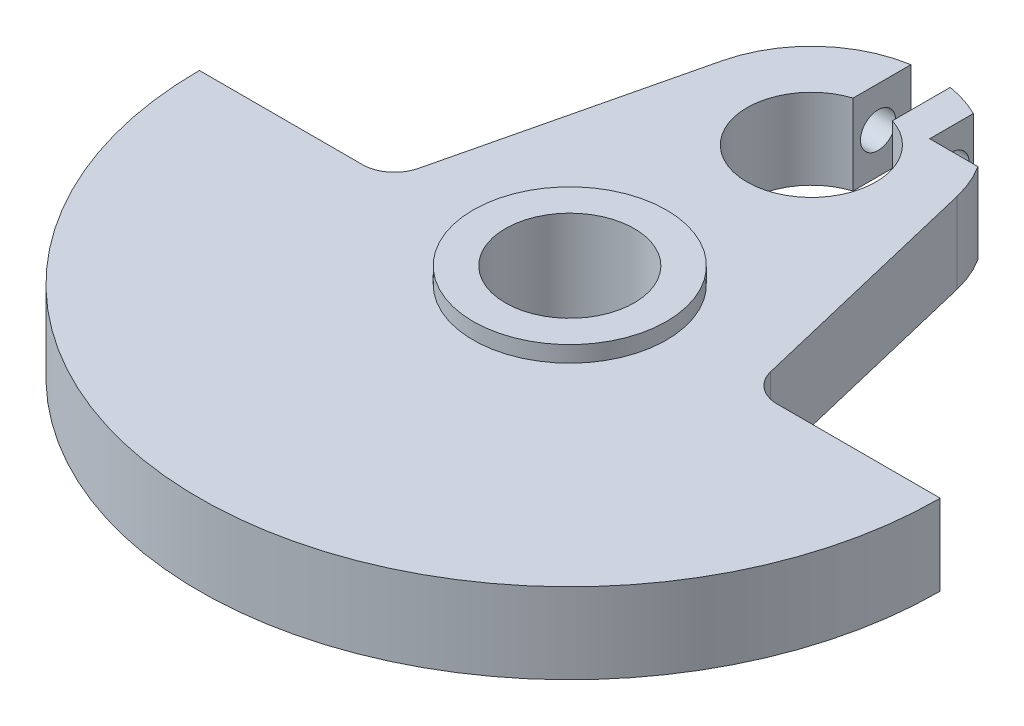
ISO-10303-21;
HEADER;
FILE_DESCRIPTION(('STEP AP214'),'2;1');
FILE_NAME('part.step','',(''),(''),'','','');
FILE_SCHEMA(('AUTOMOTIVE_DESIGN { 1 0 10303 214 1 1 1 1 }'));
ENDSEC;
DATA;
#1=APPLICATION_CONTEXT('core data for automotive mechanical design processes');
#2=APPLICATION_PROTOCOL_DEFINITION('international standard','automotive_design',2000,#1);
#3=PRODUCT_CONTEXT('',#1,'mechanical');
#4=PRODUCT('Part','Part','',(#3));
#5=PRODUCT_RELATED_PRODUCT_CATEGORY('part','',(#4));
#6=PRODUCT_DEFINITION_FORMATION('','',#4);
#7=PRODUCT_DEFINITION_CONTEXT('part definition',#1,'design');
#8=PRODUCT_DEFINITION('design','',#6,#7);
#9=PRODUCT_DEFINITION_SHAPE('','',#8);
#10=(LENGTH_UNIT() NAMED_UNIT(*) SI_UNIT(.MILLI.,.METRE.));
#11=(NAMED_UNIT(*) PLANE_ANGLE_UNIT() SI_UNIT($,.RADIAN.));
#12=(NAMED_UNIT(*) SI_UNIT($,.STERADIAN.) SOLID_ANGLE_UNIT());
#13=UNCERTAINTY_MEASURE_WITH_UNIT(LENGTH_MEASURE(1.E-05),#10,'distance_accuracy_value','');
#14=(GEOMETRIC_REPRESENTATION_CONTEXT(3) GLOBAL_UNCERTAINTY_ASSIGNED_CONTEXT((#13)) GLOBAL_UNIT_ASSIGNED_CONTEXT((#10,
#11,#12)) REPRESENTATION_CONTEXT('',''));
#15=CARTESIAN_POINT('',(0.,0.,0.));
#16=DIRECTION('',(0.,0.,1.));
#17=DIRECTION('',(1.,0.,0.));
#18=AXIS2_PLACEMENT_3D('',#15,#16,#17);
#19=CARTESIAN_POINT('',(0.,5.,-15.));
#20=DIRECTION('',(0.,-1.,0.));
#21=DIRECTION('',(0.,0.,-1.));
#22=AXIS2_PLACEMENT_3D('',#19,#20,#21);
#23=CYLINDRICAL_SURFACE('',#22,7.5);
#24=CARTESIAN_POINT('',(0.,5.,-15.));
#25=DIRECTION('',(0.,1.,0.));
#26=DIRECTION('',(0.,0.,1.));
#27=AXIS2_PLACEMENT_3D('',#24,#25,#26);
#28=CIRCLE('',#27,7.5);
#29=CARTESIAN_POINT('',(3.34428877022475,5.,-21.7131015649511));
#30=VERTEX_POINT('',#29);
#31=CARTESIAN_POINT('',(1.22065556157335,5.,-22.4));
#32=VERTEX_POINT('',#31);
#33=EDGE_CURVE('E229',#30,#32,#28,.T.);
#34=ORIENTED_EDGE('',*,*,#33,.F.);
#35=DIRECTION('',(0.,1.,0.));
#36=VECTOR('',#35,1.);
#37=CARTESIAN_POINT('',(3.34428877022475,-5.,-21.7131015649511));
#38=LINE('',#37,#36);
#39=CARTESIAN_POINT('',(3.34428877022475,0.,-21.7131015649511));
#40=VERTEX_POINT('',#39);
#41=EDGE_CURVE('E162',#40,#30,#38,.T.);
#42=ORIENTED_EDGE('',*,*,#41,.F.);
#43=CARTESIAN_POINT('',(0.,0.,-15.));
#44=DIRECTION('',(0.,1.,0.));
#45=DIRECTION('',(0.,0.,1.));
#46=AXIS2_PLACEMENT_3D('',#43,#44,#45);
#47=CIRCLE('',#46,7.5);
#48=CARTESIAN_POINT('',(1.22065556157336,0.,-22.4));
#49=VERTEX_POINT('',#48);
#50=EDGE_CURVE('E67',#40,#49,#47,.T.);
#51=ORIENTED_EDGE('',*,*,#50,.T.);
#52=DIRECTION('',(0.,1.,0.));
#53=VECTOR('',#52,1.);
#54=CARTESIAN_POINT('',(1.22065556157335,-5.,-22.4));
#55=LINE('',#54,#53);
#56=EDGE_CURVE('E200',#49,#32,#55,.T.);
#57=ORIENTED_EDGE('',*,*,#56,.T.);
#58=EDGE_LOOP('',(#34,#42,#51,#57));
#59=FACE_BOUND('',#58,.T.);
#60=ADVANCED_FACE('F42',(#59),#23,.T.);
#61=CARTESIAN_POINT('',(-3.82669697274159,2.5,-21.4503015649511));
#62=CARTESIAN_POINT('',(-3.82669928130983,2.53393569622543,-21.4503003406648));
#63=CARTESIAN_POINT('',(-3.82939375114992,2.56788092493394,-21.4487039639403));
#64=CARTESIAN_POINT('',(-3.83984613179999,2.63469958030938,-21.4424852601792));
#65=CARTESIAN_POINT('',(-3.84761017627981,2.6675716579203,-21.4378592675951));
#66=CARTESIAN_POINT('',(-3.86996863230368,2.73974274700897,-21.4244494213989));
#67=CARTESIAN_POINT('',(-3.88580984738943,2.77850666761312,-21.4148999021591));
#68=CARTESIAN_POINT('',(-3.92246173587816,2.85258003425906,-21.3925547586091));
#69=CARTESIAN_POINT('',(-3.9432830546488,2.88788184868147,-21.3797521769138));
#70=CARTESIAN_POINT('',(-4.00203971602199,2.97541285657541,-21.3431440738191));
#71=CARTESIAN_POINT('',(-4.04270677846446,3.02495812549658,-21.3173684729042));
#72=CARTESIAN_POINT('',(-4.12905792636834,3.11649744295039,-21.2612746074731));
#73=CARTESIAN_POINT('',(-4.17475542865725,3.1584704691529,-21.2309441120672));
#74=CARTESIAN_POINT('',(-4.26197323181263,3.23009332904819,-21.1715427701418));
#75=CARTESIAN_POINT('',(-4.3030955651004,3.26064734533713,-21.1429624127618));
#76=CARTESIAN_POINT('',(-4.38666949271357,3.31749162294398,-21.0835654367029));
#77=CARTESIAN_POINT('',(-4.42912194268096,3.34377906955707,-21.0527473610199));
#78=CARTESIAN_POINT('',(-4.55768768612363,3.41670954759116,-20.9572509173701));
#79=CARTESIAN_POINT('',(-4.64498779692712,3.45740386403652,-20.8895448639376));
#80=CARTESIAN_POINT('',(-4.82400137468685,3.52506599013681,-20.7439532139093));
#81=CARTESIAN_POINT('',(-4.91572489217409,3.55127828322477,-20.6657343940692));
#82=CARTESIAN_POINT('',(-5.09705763837074,3.58569964461631,-20.5031592911539));
#83=CARTESIAN_POINT('',(-5.18666944863723,3.59393195805962,-20.4188110784038));
#84=CARTESIAN_POINT('',(-5.34346399550269,3.59028108098706,-20.2637404686692));
#85=CARTESIAN_POINT('',(-5.41147701305196,3.58217764269216,-20.1937720644461));
#86=CARTESIAN_POINT('',(-5.54316902871275,3.55117887642657,-20.0529703561569));
#87=CARTESIAN_POINT('',(-5.60685330919122,3.52830194823468,-19.9821382353319));
#88=CARTESIAN_POINT('',(-5.71413607577338,3.47296456535768,-19.8583711995083));
#89=CARTESIAN_POINT('',(-5.75900476306389,3.44387569614168,-19.8050359219047));
#90=CARTESIAN_POINT('',(-5.84385858099201,3.3749767654413,-19.701465131374));
#91=CARTESIAN_POINT('',(-5.88384995146326,3.3351806160159,-19.6512256993658));
#92=CARTESIAN_POINT('',(-5.9508476941981,3.25290482585525,-19.5650667282073));
#93=CARTESIAN_POINT('',(-5.97889043516184,3.21225536743807,-19.5282106248161));
#94=CARTESIAN_POINT('',(-6.03003182484578,3.12387076668761,-19.4598807272806));
#95=CARTESIAN_POINT('',(-6.05313179078869,3.07613751790303,-19.4284054996128));
#96=CARTESIAN_POINT('',(-6.09371162707224,2.9740335513412,-19.3724010061019));
#97=CARTESIAN_POINT('',(-6.11115001285246,2.91961769589371,-19.3479231620693));
#98=CARTESIAN_POINT('',(-6.13942156462048,2.80597892810599,-19.3079127889247));
#99=CARTESIAN_POINT('',(-6.15025959890045,2.74675959534174,-19.2923736672534));
#100=CARTESIAN_POINT('',(-6.16390769582609,2.63337849012873,-19.2727467027248));
#101=CARTESIAN_POINT('',(-6.16755883416576,2.57952264835695,-19.2674603989998));
#102=CARTESIAN_POINT('',(-6.1693025396818,2.47154288388304,-19.264939700656));
#103=CARTESIAN_POINT('',(-6.16739751258686,2.41741908733196,-19.2677018212008));
#104=CARTESIAN_POINT('',(-6.15839484653984,2.31394067302709,-19.2806806881231));
#105=CARTESIAN_POINT('',(-6.15162329237717,2.26449729873343,-19.2904291974531));
#106=CARTESIAN_POINT('',(-6.13348233412216,2.1682115653982,-19.3163227888497));
#107=CARTESIAN_POINT('',(-6.12211283597888,2.12136925958376,-19.3324680017607));
#108=CARTESIAN_POINT('',(-6.09467809332261,2.02985178382106,-19.3709807251768));
#109=CARTESIAN_POINT('',(-6.0784704956084,1.98529884086825,-19.3935356952197));
#110=CARTESIAN_POINT('',(-6.04199266409521,1.90088675518016,-19.4435663635227));
#111=CARTESIAN_POINT('',(-6.0217211464299,1.86102910210591,-19.4710436165292));
#112=CARTESIAN_POINT('',(-5.97514759747478,1.78228780894268,-19.5331307440468));
#113=CARTESIAN_POINT('',(-5.94842441600791,1.74401335616336,-19.5681948096897));
#114=CARTESIAN_POINT('',(-5.89127016738782,1.67404104085055,-19.6416712144979));
#115=CARTESIAN_POINT('',(-5.86083671919804,1.64234743716511,-19.6800856992226));
#116=CARTESIAN_POINT('',(-5.78182497527731,1.57203972250905,-19.7776611570419));
#117=CARTESIAN_POINT('',(-5.7314446273439,1.53718125131164,-19.8380824080666));
#118=CARTESIAN_POINT('',(-5.62570588097358,1.48043416493786,-19.9606487608614));
#119=CARTESIAN_POINT('',(-5.5703372636102,1.45857290495714,-20.0227972123115));
#120=CARTESIAN_POINT('',(-5.43739196489079,1.4213174575963,-20.1669341400712));
#121=CARTESIAN_POINT('',(-5.35845029572946,1.41034064400308,-20.2487997484408));
#122=CARTESIAN_POINT('',(-5.19670087548146,1.40604013119286,-20.4090041474206));
#123=CARTESIAN_POINT('',(-5.1138891607517,1.41273493824398,-20.4873391533205));
#124=CARTESIAN_POINT('',(-4.9444920217378,1.44200149525516,-20.6405076426835));
#125=CARTESIAN_POINT('',(-4.85786364186707,1.46492122983493,-20.7152253156982));
#126=CARTESIAN_POINT('',(-4.68452038466542,1.52588308738487,-20.8581452867041));
#127=CARTESIAN_POINT('',(-4.59780550996733,1.56392476327411,-20.9263477772429));
#128=CARTESIAN_POINT('',(-4.44506452793701,1.64567831364095,-21.0414007609767));
#129=CARTESIAN_POINT('',(-4.37856002446408,1.68646441562985,-21.0897077225617));
#130=CARTESIAN_POINT('',(-4.24910675821605,1.77861113126298,-21.180718762939));
#131=CARTESIAN_POINT('',(-4.18615105673574,1.82995012819074,-21.2234340076461));
#132=CARTESIAN_POINT('',(-4.09262488682045,1.92099932654604,-21.2850721601604));
#133=CARTESIAN_POINT('',(-4.05957990730887,1.95650382196685,-21.3064399577743));
#134=CARTESIAN_POINT('',(-3.9973572313955,2.03237966169916,-21.3460603473724));
#135=CARTESIAN_POINT('',(-3.96817524480093,2.07274551022838,-21.3643164018155));
#136=CARTESIAN_POINT('',(-3.9224483276851,2.147923857984,-21.3925686368974));
#137=CARTESIAN_POINT('',(-3.90457261896801,2.18156822835992,-21.4034867060206));
#138=CARTESIAN_POINT('',(-3.87350358339642,2.25173862855914,-21.4223283008049));
#139=CARTESIAN_POINT('',(-3.86030047268836,2.28825843904795,-21.4302580858562));
#140=CARTESIAN_POINT('',(-3.84254453965518,2.35403700605249,-21.4408796629473));
#141=CARTESIAN_POINT('',(-3.83664903322573,2.38279930412899,-21.4443886410419));
#142=CARTESIAN_POINT('',(-3.82872515328936,2.44103889741245,-21.4490995831627));
#143=CARTESIAN_POINT('',(-3.82669496700198,2.47051585088385,-21.4503026286404));
#144=CARTESIAN_POINT('',(-3.82669697274159,2.5,-21.4503015649511));
#145=B_SPLINE_CURVE_WITH_KNOTS('',3,(#61,#62,#63,#64,#65,#66,#67,#68,#69,#70,#71,#72,#73,#74,
#75,#76,#77,#78,#79,#80,#81,#82,#83,#84,#85,#86,#87,#88,#89,#90,#91,#92,#93,#94,#95,#96,#97,#98,
#99,#100,#101,#102,#103,#104,#105,#106,#107,#108,#109,#110,#111,#112,#113,#114,#115,#116,#117,
#118,#119,#120,#121,#122,#123,#124,#125,#126,#127,#128,#129,#130,#131,#132,#133,#134,#135,#136,
#137,#138,#139,#140,#141,#142,#143,#144),.UNSPECIFIED.,.T.,.F.,(4,2,2,2,2,2,2,2,2,2,2,2,2,2,2,2,
2,2,2,2,2,2,2,2,2,2,2,2,2,2,2,2,2,2,2,2,2,2,2,2,2,4),(0.,0.101688136885721,0.203499534621864,
0.331627898168534,0.460032633280378,0.666140365414502,0.872811779340773,1.0485616785013,
1.2244270547043,1.5762497589701,1.94501748455072,2.31330817154704,2.60605445301145,
2.8984368322753,3.12419537127576,3.34966198513946,3.53378501273669,3.71785891126578,
3.9032526484467,4.08850947663779,4.25036739252094,4.41215523698142,4.56400702566806,
4.71586192063984,4.87271936668054,5.02962644515741,5.20410907257022,5.37870426824828,
5.6354138485841,5.89266182955949,6.23359599256361,6.57488733399008,6.92372940617591,
7.27256116559606,7.54721769399809,7.82131712018617,7.98000287470097,8.13851088915099,
8.25703012320742,8.37529970326775,8.46369026658413,8.55203936575584),.UNSPECIFIED.);
#146=CARTESIAN_POINT('',(-3.82669697274159,2.5,-21.4503015649511));
#147=VERTEX_POINT('',#146);
#148=EDGE_CURVE('E166',#147,#147,#145,.T.);
#149=ORIENTED_EDGE('',*,*,#148,.T.);
#150=EDGE_LOOP('',(#149));
#151=FACE_BOUND('',#150,.T.);
#152=CARTESIAN_POINT('',(-1.22065556157336,5.,-22.4));
#153=VERTEX_POINT('',#152);
#154=CARTESIAN_POINT('',(-7.29418530553555,5.,-16.7449529301701));
#155=VERTEX_POINT('',#154);
#156=EDGE_CURVE('E225',#153,#155,#28,.T.);
#157=ORIENTED_EDGE('',*,*,#156,.F.);
#158=DIRECTION('',(0.,1.,0.));
#159=VECTOR('',#158,1.);
#160=CARTESIAN_POINT('',(-1.22065556157336,-5.,-22.4));
#161=LINE('',#160,#159);
#162=CARTESIAN_POINT('',(-1.22065556157336,0.,-22.4));
#163=VERTEX_POINT('',#162);
#164=EDGE_CURVE('E197',#163,#153,#161,.T.);
#165=ORIENTED_EDGE('',*,*,#164,.F.);
#166=CARTESIAN_POINT('',(-7.29418530553555,0.,-16.7449529301701));
#167=VERTEX_POINT('',#166);
#168=EDGE_CURVE('E251',#163,#167,#47,.T.);
#169=ORIENTED_EDGE('',*,*,#168,.T.);
#170=DIRECTION('',(0.,-1.,0.));
#171=VECTOR('',#170,1.);
#172=CARTESIAN_POINT('',(-7.29418530553555,5.,-16.7449529301701));
#173=LINE('',#172,#171);
#174=EDGE_CURVE('E289',#155,#167,#173,.T.);
#175=ORIENTED_EDGE('',*,*,#174,.F.);
#176=EDGE_LOOP('',(#157,#165,#169,#175));
#177=FACE_BOUND('',#176,.T.);
#178=ADVANCED_FACE('F324',(#151,#177),#23,.T.);
#179=CARTESIAN_POINT('',(12.8779821402295,5.,-2.));
#180=DIRECTION('',(0.,-1.,0.));
#181=DIRECTION('',(0.,0.,-1.));
#182=AXIS2_PLACEMENT_3D('',#179,#180,#181);
#183=CYLINDRICAL_SURFACE('',#182,2.);
#184=CARTESIAN_POINT('',(12.8779821402295,0.,-2.));
#185=DIRECTION('',(0.,-1.,0.));
#186=DIRECTION('',(0.,0.,-1.));
#187=AXIS2_PLACEMENT_3D('',#184,#185,#186);
#188=CIRCLE('',#187,2.);
#189=CARTESIAN_POINT('',(12.8779821402295,0.,0.));
#190=VERTEX_POINT('',#189);
#191=CARTESIAN_POINT('',(10.9328660587534,0.,-1.53467921862131));
#192=VERTEX_POINT('',#191);
#193=EDGE_CURVE('E216',#190,#192,#188,.T.);
#194=ORIENTED_EDGE('',*,*,#193,.T.);
#195=DIRECTION('',(0.,-1.,0.));
#196=VECTOR('',#195,1.);
#197=CARTESIAN_POINT('',(10.9328660587534,5.,-1.53467921862131));
#198=LINE('',#197,#196);
#199=CARTESIAN_POINT('',(10.9328660587534,5.,-1.53467921862131));
#200=VERTEX_POINT('',#199);
#201=EDGE_CURVE('E297',#200,#192,#198,.T.);
#202=ORIENTED_EDGE('',*,*,#201,.F.);
#203=CARTESIAN_POINT('',(12.8779821402295,5.,-2.));
#204=DIRECTION('',(0.,-1.,0.));
#205=DIRECTION('',(0.,0.,-1.));
#206=AXIS2_PLACEMENT_3D('',#203,#204,#205);
#207=CIRCLE('',#206,2.);
#208=CARTESIAN_POINT('',(12.8779821402295,5.,0.));
#209=VERTEX_POINT('',#208);
#210=EDGE_CURVE('E217',#209,#200,#207,.T.);
#211=ORIENTED_EDGE('',*,*,#210,.F.);
#212=DIRECTION('',(0.,-1.,0.));
#213=VECTOR('',#212,1.);
#214=CARTESIAN_POINT('',(12.8779821402295,5.,0.));
#215=LINE('',#214,#213);
#216=EDGE_CURVE('E244',#209,#190,#215,.T.);
#217=ORIENTED_EDGE('',*,*,#216,.T.);
#218=EDGE_LOOP('',(#194,#202,#211,#217));
#219=FACE_BOUND('',#218,.T.);
#220=ADVANCED_FACE('F44',(#219),#183,.F.);
#221=CARTESIAN_POINT('',(10.9328660587534,5.,-1.53467921862131));
#222=DIRECTION('',(-0.972558040738073,0.,0.232660390689349));
#223=DIRECTION('',(0.232660390689349,0.,0.972558040738073));
#224=AXIS2_PLACEMENT_3D('',#221,#222,#223);
#225=PLANE('',#224);
#226=DIRECTION('',(-0.232660390689349,0.,-0.972558040738073));
#227=VECTOR('',#226,1.);
#228=CARTESIAN_POINT('',(10.9328660587534,0.,-1.53467921862131));
#229=LINE('',#228,#227);
#230=CARTESIAN_POINT('',(7.29418530553555,0.,-16.7449529301701));
#231=VERTEX_POINT('',#230);
#232=EDGE_CURVE('E248',#192,#231,#229,.T.);
#233=ORIENTED_EDGE('',*,*,#232,.T.);
#234=DIRECTION('',(0.,-1.,0.));
#235=VECTOR('',#234,1.);
#236=CARTESIAN_POINT('',(7.29418530553555,5.,-16.7449529301701));
#237=LINE('',#236,#235);
#238=CARTESIAN_POINT('',(7.29418530553555,5.,-16.7449529301701));
#239=VERTEX_POINT('',#238);
#240=EDGE_CURVE('E293',#239,#231,#237,.T.);
#241=ORIENTED_EDGE('',*,*,#240,.F.);
#242=DIRECTION('',(-0.232660390689349,0.,-0.972558040738073));
#243=VECTOR('',#242,1.);
#244=CARTESIAN_POINT('',(10.9328660587534,5.,-1.53467921862131));
#245=LINE('',#244,#243);
#246=EDGE_CURVE('E221',#200,#239,#245,.T.);
#247=ORIENTED_EDGE('',*,*,#246,.F.);
#248=ORIENTED_EDGE('',*,*,#201,.T.);
#249=EDGE_LOOP('',(#233,#241,#247,#248));
#250=FACE_BOUND('',#249,.T.);
#251=ADVANCED_FACE('F365',(#250),#225,.F.);
#252=CARTESIAN_POINT('',(6.34428877022476,0.,-19.));
#253=VERTEX_POINT('',#252);
#254=EDGE_CURVE('E252',#231,#253,#47,.T.);
#255=ORIENTED_EDGE('',*,*,#254,.T.);
#256=DIRECTION('',(0.,1.,0.));
#257=VECTOR('',#256,1.);
#258=CARTESIAN_POINT('',(6.34428877022476,-5.,-19.));
#259=LINE('',#258,#257);
#260=CARTESIAN_POINT('',(6.34428877022476,5.,-19.));
#261=VERTEX_POINT('',#260);
#262=EDGE_CURVE('E59',#253,#261,#259,.T.);
#263=ORIENTED_EDGE('',*,*,#262,.T.);
#264=EDGE_CURVE('E171',#239,#261,#28,.T.);
#265=ORIENTED_EDGE('',*,*,#264,.F.);
#266=ORIENTED_EDGE('',*,*,#240,.T.);
#267=EDGE_LOOP('',(#255,#263,#265,#266));
#268=FACE_BOUND('',#267,.T.);
#269=ADVANCED_FACE('F362',(#268),#23,.T.);
#270=CARTESIAN_POINT('',(-10.9328660587534,5.,-1.53467921862131));
#271=DIRECTION('',(0.972558040738073,0.,0.232660390689349));
#272=DIRECTION('',(0.232660390689349,0.,-0.972558040738073));
#273=AXIS2_PLACEMENT_3D('',#270,#271,#272);
#274=PLANE('',#273);
#275=DIRECTION('',(-0.232660390689349,0.,0.972558040738073));
#276=VECTOR('',#275,1.);
#277=CARTESIAN_POINT('',(-10.9328660587534,0.,-1.53467921862131));
#278=LINE('',#277,#276);
#279=CARTESIAN_POINT('',(-10.9328660587534,0.,-1.53467921862131));
#280=VERTEX_POINT('',#279);
#281=EDGE_CURVE('E256',#167,#280,#278,.T.);
#282=ORIENTED_EDGE('',*,*,#281,.T.);
#283=DIRECTION('',(0.,-1.,0.));
#284=VECTOR('',#283,1.);
#285=CARTESIAN_POINT('',(-10.9328660587534,5.,-1.53467921862131));
#286=LINE('',#285,#284);
#287=CARTESIAN_POINT('',(-10.9328660587534,5.,-1.53467921862131));
#288=VERTEX_POINT('',#287);
#289=EDGE_CURVE('E285',#288,#280,#286,.T.);
#290=ORIENTED_EDGE('',*,*,#289,.F.);
#291=DIRECTION('',(-0.232660390689349,0.,0.972558040738073));
#292=VECTOR('',#291,1.);
#293=CARTESIAN_POINT('',(-10.9328660587534,5.,-1.53467921862131));
#294=LINE('',#293,#292);
#295=EDGE_CURVE('E228',#155,#288,#294,.T.);
#296=ORIENTED_EDGE('',*,*,#295,.F.);
#297=ORIENTED_EDGE('',*,*,#174,.T.);
#298=EDGE_LOOP('',(#282,#290,#296,#297));
#299=FACE_BOUND('',#298,.T.);
#300=ADVANCED_FACE('F330',(#299),#274,.F.);
#301=CARTESIAN_POINT('',(-12.8779821402295,5.,-2.));
#302=DIRECTION('',(0.,-1.,0.));
#303=DIRECTION('',(0.,0.,-1.));
#304=AXIS2_PLACEMENT_3D('',#301,#302,#303);
#305=CYLINDRICAL_SURFACE('',#304,2.);
#306=CARTESIAN_POINT('',(-12.8779821402295,0.,-2.));
#307=DIRECTION('',(0.,-1.,0.));
#308=DIRECTION('',(0.,0.,1.));
#309=AXIS2_PLACEMENT_3D('',#306,#307,#308);
#310=CIRCLE('',#309,2.);
#311=CARTESIAN_POINT('',(-12.8779821402295,0.,0.));
#312=VERTEX_POINT('',#311);
#313=EDGE_CURVE('E259',#280,#312,#310,.T.);
#314=ORIENTED_EDGE('',*,*,#313,.T.);
#315=DIRECTION('',(0.,-1.,0.));
#316=VECTOR('',#315,1.);
#317=CARTESIAN_POINT('',(-12.8779821402295,5.,0.));
#318=LINE('',#317,#316);
#319=CARTESIAN_POINT('',(-12.8779821402295,5.,0.));
#320=VERTEX_POINT('',#319);
#321=EDGE_CURVE('E281',#320,#312,#318,.T.);
#322=ORIENTED_EDGE('',*,*,#321,.F.);
#323=CARTESIAN_POINT('',(-12.8779821402295,5.,-2.));
#324=DIRECTION('',(0.,-1.,0.));
#325=DIRECTION('',(0.,0.,1.));
#326=AXIS2_PLACEMENT_3D('',#323,#324,#325);
#327=CIRCLE('',#326,2.);
#328=EDGE_CURVE('E232',#288,#320,#327,.T.);
#329=ORIENTED_EDGE('',*,*,#328,.F.);
#330=ORIENTED_EDGE('',*,*,#289,.T.);
#331=EDGE_LOOP('',(#314,#322,#329,#330));
#332=FACE_BOUND('',#331,.T.);
#333=ADVANCED_FACE('F339',(#332),#305,.F.);
#334=CARTESIAN_POINT('',(-23.,5.,0.));
#335=DIRECTION('',(0.,0.,1.));
#336=DIRECTION('',(1.,0.,0.));
#337=AXIS2_PLACEMENT_3D('',#334,#335,#336);
#338=PLANE('',#337);
#339=DIRECTION('',(-1.,0.,0.));
#340=VECTOR('',#339,1.);
#341=CARTESIAN_POINT('',(-23.,0.,0.));
#342=LINE('',#341,#340);
#343=CARTESIAN_POINT('',(-23.,0.,0.));
#344=VERTEX_POINT('',#343);
#345=EDGE_CURVE('E262',#312,#344,#342,.T.);
#346=ORIENTED_EDGE('',*,*,#345,.T.);
#347=DIRECTION('',(0.,-1.,0.));
#348=VECTOR('',#347,1.);
#349=CARTESIAN_POINT('',(-23.,5.,0.));
#350=LINE('',#349,#348);
#351=CARTESIAN_POINT('',(-23.,5.,0.));
#352=VERTEX_POINT('',#351);
#353=EDGE_CURVE('E277',#352,#344,#350,.T.);
#354=ORIENTED_EDGE('',*,*,#353,.F.);
#355=DIRECTION('',(-1.,0.,0.));
#356=VECTOR('',#355,1.);
#357=CARTESIAN_POINT('',(-23.,5.,0.));
#358=LINE('',#357,#356);
#359=EDGE_CURVE('E235',#320,#352,#358,.T.);
#360=ORIENTED_EDGE('',*,*,#359,.F.);
#361=ORIENTED_EDGE('',*,*,#321,.T.);
#362=EDGE_LOOP('',(#346,#354,#360,#361));
#363=FACE_BOUND('',#362,.T.);
#364=ADVANCED_FACE('F343',(#363),#338,.F.);
#365=CARTESIAN_POINT('',(0.,5.,0.));
#366=DIRECTION('',(0.,-1.,0.));
#367=DIRECTION('',(0.,0.,-1.));
#368=AXIS2_PLACEMENT_3D('',#365,#366,#367);
#369=CYLINDRICAL_SURFACE('',#368,23.);
#370=CARTESIAN_POINT('',(0.,0.,0.));
#371=DIRECTION('',(0.,1.,0.));
#372=DIRECTION('',(0.,0.,1.));
#373=AXIS2_PLACEMENT_3D('',#370,#371,#372);
#374=CIRCLE('',#373,23.);
#375=CARTESIAN_POINT('',(23.,0.,0.));
#376=VERTEX_POINT('',#375);
#377=EDGE_CURVE('E265',#344,#376,#374,.T.);
#378=ORIENTED_EDGE('',*,*,#377,.T.);
#379=DIRECTION('',(0.,-1.,0.));
#380=VECTOR('',#379,1.);
#381=CARTESIAN_POINT('',(23.,5.,0.));
#382=LINE('',#381,#380);
#383=CARTESIAN_POINT('',(23.,5.,0.));
#384=VERTEX_POINT('',#383);
#385=EDGE_CURVE('E273',#384,#376,#382,.T.);
#386=ORIENTED_EDGE('',*,*,#385,.F.);
#387=CARTESIAN_POINT('',(0.,5.,0.));
#388=DIRECTION('',(0.,1.,0.));
#389=DIRECTION('',(0.,0.,1.));
#390=AXIS2_PLACEMENT_3D('',#387,#388,#389);
#391=CIRCLE('',#390,23.);
#392=EDGE_CURVE('E238',#352,#384,#391,.T.);
#393=ORIENTED_EDGE('',*,*,#392,.F.);
#394=ORIENTED_EDGE('',*,*,#353,.T.);
#395=EDGE_LOOP('',(#378,#386,#393,#394));
#396=FACE_BOUND('',#395,.T.);
#397=ADVANCED_FACE('F376',(#396),#369,.T.);
#398=CARTESIAN_POINT('',(23.,5.,0.));
#399=DIRECTION('',(0.,0.,1.));
#400=DIRECTION('',(1.,0.,0.));
#401=AXIS2_PLACEMENT_3D('',#398,#399,#400);
#402=PLANE('',#401);
#403=DIRECTION('',(-1.,0.,0.));
#404=VECTOR('',#403,1.);
#405=CARTESIAN_POINT('',(23.,0.,0.));
#406=LINE('',#405,#404);
#407=EDGE_CURVE('E222',#376,#190,#406,.T.);
#408=ORIENTED_EDGE('',*,*,#407,.T.);
#409=ORIENTED_EDGE('',*,*,#216,.F.);
#410=DIRECTION('',(-1.,0.,0.));
#411=VECTOR('',#410,1.);
#412=CARTESIAN_POINT('',(23.,5.,0.));
#413=LINE('',#412,#411);
#414=EDGE_CURVE('E241',#384,#209,#413,.T.);
#415=ORIENTED_EDGE('',*,*,#414,.F.);
#416=ORIENTED_EDGE('',*,*,#385,.T.);
#417=EDGE_LOOP('',(#408,#409,#415,#416));
#418=FACE_BOUND('',#417,.T.);
#419=ADVANCED_FACE('F374',(#418),#402,.F.);
#420=CARTESIAN_POINT('',(12.8779821402295,5.,-2.));
#421=DIRECTION('',(0.,-1.,0.));
#422=DIRECTION('',(0.,0.,-1.));
#423=AXIS2_PLACEMENT_3D('',#420,#421,#422);
#424=PLANE('',#423);
#425=CARTESIAN_POINT('',(0.,5.,0.));
#426=DIRECTION('',(0.,-1.,0.));
#427=DIRECTION('',(0.,0.,-1.));
#428=AXIS2_PLACEMENT_3D('',#425,#426,#427);
#429=CIRCLE('',#428,6.);
#430=CARTESIAN_POINT('',(0.,5.,-6.));
#431=VERTEX_POINT('',#430);
#432=EDGE_CURVE('E301',#431,#431,#429,.F.);
#433=ORIENTED_EDGE('',*,*,#432,.F.);
#434=EDGE_LOOP('',(#433));
#435=FACE_BOUND('',#434,.T.);
#436=DIRECTION('',(1.,0.,0.));
#437=VECTOR('',#436,1.);
#438=CARTESIAN_POINT('',(3.34428877022476,5.,-19.));
#439=LINE('',#438,#437);
#440=CARTESIAN_POINT('',(3.34428877022476,5.,-19.));
#441=VERTEX_POINT('',#440);
#442=EDGE_CURVE('E154',#441,#261,#439,.T.);
#443=ORIENTED_EDGE('',*,*,#442,.F.);
#444=DIRECTION('',(0.,0.,1.));
#445=VECTOR('',#444,1.);
#446=CARTESIAN_POINT('',(3.34428877022476,5.,-19.));
#447=LINE('',#446,#445);
#448=EDGE_CURVE('E160',#30,#441,#447,.T.);
#449=ORIENTED_EDGE('',*,*,#448,.F.);
#450=ORIENTED_EDGE('',*,*,#33,.T.);
#451=DIRECTION('',(0.,0.,-1.));
#452=VECTOR('',#451,1.);
#453=CARTESIAN_POINT('',(1.22065556157336,5.,-18.8091993909482));
#454=LINE('',#453,#452);
#455=CARTESIAN_POINT('',(1.22065556157336,5.,-18.8091993909482));
#456=VERTEX_POINT('',#455);
#457=EDGE_CURVE('E184',#456,#32,#454,.T.);
#458=ORIENTED_EDGE('',*,*,#457,.F.);
#459=CARTESIAN_POINT('',(0.,5.,-15.));
#460=DIRECTION('',(0.,1.,0.));
#461=DIRECTION('',(0.,0.,1.));
#462=AXIS2_PLACEMENT_3D('',#459,#460,#461);
#463=CIRCLE('',#462,4.);
#464=CARTESIAN_POINT('',(-1.22065556157336,5.,-18.8091993909482));
#465=VERTEX_POINT('',#464);
#466=EDGE_CURVE('E178',#465,#456,#463,.T.);
#467=ORIENTED_EDGE('',*,*,#466,.F.);
#468=DIRECTION('',(0.,0.,1.));
#469=VECTOR('',#468,1.);
#470=CARTESIAN_POINT('',(-1.22065556157336,5.,-18.8091993909482));
#471=LINE('',#470,#469);
#472=EDGE_CURVE('E188',#153,#465,#471,.T.);
#473=ORIENTED_EDGE('',*,*,#472,.F.);
#474=ORIENTED_EDGE('',*,*,#156,.T.);
#475=ORIENTED_EDGE('',*,*,#295,.T.);
#476=ORIENTED_EDGE('',*,*,#328,.T.);
#477=ORIENTED_EDGE('',*,*,#359,.T.);
#478=ORIENTED_EDGE('',*,*,#392,.T.);
#479=ORIENTED_EDGE('',*,*,#414,.T.);
#480=ORIENTED_EDGE('',*,*,#210,.T.);
#481=ORIENTED_EDGE('',*,*,#246,.T.);
#482=ORIENTED_EDGE('',*,*,#264,.T.);
#483=EDGE_LOOP('',(#443,#449,#450,#458,#467,#473,#474,#475,#476,#477,#478,#479,#480,#481,#482));
#484=FACE_BOUND('',#483,.T.);
#485=ADVANCED_FACE('F169',(#435,#484),#424,.F.);
#486=CARTESIAN_POINT('',(12.8779821402295,0.,-2.));
#487=DIRECTION('',(0.,-1.,0.));
#488=DIRECTION('',(0.,0.,-1.));
#489=AXIS2_PLACEMENT_3D('',#486,#487,#488);
#490=PLANE('',#489);
#491=DIRECTION('',(0.,0.,-1.));
#492=VECTOR('',#491,1.);
#493=CARTESIAN_POINT('',(3.34428877022475,0.,-2.));
#494=LINE('',#493,#492);
#495=CARTESIAN_POINT('',(3.34428877022476,0.,-19.));
#496=VERTEX_POINT('',#495);
#497=EDGE_CURVE('E11',#496,#40,#494,.T.);
#498=ORIENTED_EDGE('',*,*,#497,.F.);
#499=DIRECTION('',(-1.,0.,0.));
#500=VECTOR('',#499,1.);
#501=CARTESIAN_POINT('',(12.8779821402295,0.,-19.));
#502=LINE('',#501,#500);
#503=EDGE_CURVE('E52',#253,#496,#502,.T.);
#504=ORIENTED_EDGE('',*,*,#503,.F.);
#505=ORIENTED_EDGE('',*,*,#254,.F.);
#506=ORIENTED_EDGE('',*,*,#232,.F.);
#507=ORIENTED_EDGE('',*,*,#193,.F.);
#508=ORIENTED_EDGE('',*,*,#407,.F.);
#509=ORIENTED_EDGE('',*,*,#377,.F.);
#510=ORIENTED_EDGE('',*,*,#345,.F.);
#511=ORIENTED_EDGE('',*,*,#313,.F.);
#512=ORIENTED_EDGE('',*,*,#281,.F.);
#513=ORIENTED_EDGE('',*,*,#168,.F.);
#514=DIRECTION('',(0.,0.,-1.));
#515=VECTOR('',#514,1.);
#516=CARTESIAN_POINT('',(-1.22065556157336,0.,-2.));
#517=LINE('',#516,#515);
#518=CARTESIAN_POINT('',(-1.22065556157336,0.,-18.8091993909482));
#519=VERTEX_POINT('',#518);
#520=EDGE_CURVE('E311',#519,#163,#517,.T.);
#521=ORIENTED_EDGE('',*,*,#520,.F.);
#522=CARTESIAN_POINT('',(0.,0.,-15.));
#523=DIRECTION('',(0.,-1.,0.));
#524=DIRECTION('',(0.,0.,-1.));
#525=AXIS2_PLACEMENT_3D('',#522,#523,#524);
#526=CIRCLE('',#525,4.);
#527=CARTESIAN_POINT('',(1.22065556157336,0.,-18.8091993909482));
#528=VERTEX_POINT('',#527);
#529=EDGE_CURVE('E308',#528,#519,#526,.T.);
#530=ORIENTED_EDGE('',*,*,#529,.F.);
#531=DIRECTION('',(0.,0.,1.));
#532=VECTOR('',#531,1.);
#533=CARTESIAN_POINT('',(1.22065556157336,0.,-2.));
#534=LINE('',#533,#532);
#535=EDGE_CURVE('E305',#49,#528,#534,.T.);
#536=ORIENTED_EDGE('',*,*,#535,.F.);
#537=ORIENTED_EDGE('',*,*,#50,.F.);
#538=EDGE_LOOP('',(#498,#504,#505,#506,#507,#508,#509,#510,#511,#512,#513,#521,#530,#536,#537));
#539=FACE_BOUND('',#538,.T.);
#540=CARTESIAN_POINT('',(0.,0.,0.));
#541=DIRECTION('',(0.,1.,0.));
#542=DIRECTION('',(0.,0.,1.));
#543=AXIS2_PLACEMENT_3D('',#540,#541,#542);
#544=CIRCLE('',#543,4.);
#545=CARTESIAN_POINT('',(0.,0.,4.));
#546=VERTEX_POINT('',#545);
#547=EDGE_CURVE('E205',#546,#546,#544,.T.);
#548=ORIENTED_EDGE('',*,*,#547,.T.);
#549=EDGE_LOOP('',(#548));
#550=FACE_BOUND('',#549,.T.);
#551=ADVANCED_FACE('F333',(#539,#550),#490,.T.);
#552=CARTESIAN_POINT('',(0.,6.,0.));
#553=DIRECTION('',(0.,-1.,0.));
#554=DIRECTION('',(0.,0.,-1.));
#555=AXIS2_PLACEMENT_3D('',#552,#553,#554);
#556=CYLINDRICAL_SURFACE('',#555,6.);
#557=CARTESIAN_POINT('',(0.,6.,0.));
#558=DIRECTION('',(0.,1.,0.));
#559=DIRECTION('',(0.,0.,1.));
#560=AXIS2_PLACEMENT_3D('',#557,#558,#559);
#561=CIRCLE('',#560,6.);
#562=CARTESIAN_POINT('',(0.,6.,6.));
#563=VERTEX_POINT('',#562);
#564=EDGE_CURVE('E209',#563,#563,#561,.T.);
#565=ORIENTED_EDGE('',*,*,#564,.F.);
#566=EDGE_LOOP('',(#565));
#567=FACE_BOUND('',#566,.T.);
#568=ORIENTED_EDGE('',*,*,#432,.T.);
#569=EDGE_LOOP('',(#568));
#570=FACE_BOUND('',#569,.T.);
#571=ADVANCED_FACE('F454',(#567,#570),#556,.T.);
#572=CARTESIAN_POINT('',(0.,6.,0.));
#573=DIRECTION('',(0.,1.,0.));
#574=DIRECTION('',(0.,0.,1.));
#575=AXIS2_PLACEMENT_3D('',#572,#573,#574);
#576=PLANE('',#575);
#577=CARTESIAN_POINT('',(0.,6.,0.));
#578=DIRECTION('',(0.,1.,0.));
#579=DIRECTION('',(0.,0.,1.));
#580=AXIS2_PLACEMENT_3D('',#577,#578,#579);
#581=CIRCLE('',#580,4.);
#582=CARTESIAN_POINT('',(0.,6.,4.));
#583=VERTEX_POINT('',#582);
#584=EDGE_CURVE('E196',#583,#583,#581,.T.);
#585=ORIENTED_EDGE('',*,*,#584,.F.);
#586=EDGE_LOOP('',(#585));
#587=FACE_BOUND('',#586,.T.);
#588=ORIENTED_EDGE('',*,*,#564,.T.);
#589=EDGE_LOOP('',(#588));
#590=FACE_BOUND('',#589,.T.);
#591=ADVANCED_FACE('F459',(#587,#590),#576,.T.);
#592=CARTESIAN_POINT('',(0.,0.,0.));
#593=DIRECTION('',(0.,1.,0.));
#594=DIRECTION('',(0.,0.,1.));
#595=AXIS2_PLACEMENT_3D('',#592,#593,#594);
#596=CYLINDRICAL_SURFACE('',#595,4.);
#597=ORIENTED_EDGE('',*,*,#547,.F.);
#598=EDGE_LOOP('',(#597));
#599=FACE_BOUND('',#598,.T.);
#600=ORIENTED_EDGE('',*,*,#584,.T.);
#601=EDGE_LOOP('',(#600));
#602=FACE_BOUND('',#601,.T.);
#603=ADVANCED_FACE('F472',(#599,#602),#596,.F.);
#604=CARTESIAN_POINT('',(0.,-5.,-15.));
#605=DIRECTION('',(0.,1.,0.));
#606=DIRECTION('',(0.,0.,1.));
#607=AXIS2_PLACEMENT_3D('',#604,#605,#606);
#608=CYLINDRICAL_SURFACE('',#607,4.);
#609=ORIENTED_EDGE('',*,*,#529,.T.);
#610=DIRECTION('',(0.,1.,0.));
#611=VECTOR('',#610,1.);
#612=CARTESIAN_POINT('',(-1.22065556157336,-5.,-18.8091993909482));
#613=LINE('',#612,#611);
#614=EDGE_CURVE('E193',#519,#465,#613,.T.);
#615=ORIENTED_EDGE('',*,*,#614,.T.);
#616=ORIENTED_EDGE('',*,*,#466,.T.);
#617=DIRECTION('',(0.,1.,0.));
#618=VECTOR('',#617,1.);
#619=CARTESIAN_POINT('',(1.22065556157336,-5.,-18.8091993909482));
#620=LINE('',#619,#618);
#621=EDGE_CURVE('E192',#528,#456,#620,.T.);
#622=ORIENTED_EDGE('',*,*,#621,.F.);
#623=EDGE_LOOP('',(#609,#615,#616,#622));
#624=FACE_BOUND('',#623,.T.);
#625=ADVANCED_FACE('F357',(#624),#608,.F.);
#626=CARTESIAN_POINT('',(-1.22065556157336,-5.,-18.8091993909482));
#627=DIRECTION('',(-1.,0.,0.));
#628=DIRECTION('',(0.,0.,1.));
#629=AXIS2_PLACEMENT_3D('',#626,#627,#628);
#630=PLANE('',#629);
#631=CARTESIAN_POINT('',(-1.22065556157335,2.5,-20.3581015649511));
#632=DIRECTION('',(-1.,0.,0.));
#633=DIRECTION('',(0.,0.,1.));
#634=AXIS2_PLACEMENT_3D('',#631,#632,#633);
#635=CIRCLE('',#634,1.0922);
#636=CARTESIAN_POINT('',(-1.22065556157335,2.5,-19.2659015649511));
#637=VERTEX_POINT('',#636);
#638=EDGE_CURVE('E615',#637,#637,#635,.T.);
#639=ORIENTED_EDGE('',*,*,#638,.T.);
#640=EDGE_LOOP('',(#639));
#641=FACE_BOUND('',#640,.T.);
#642=ORIENTED_EDGE('',*,*,#520,.T.);
#643=ORIENTED_EDGE('',*,*,#164,.T.);
#644=ORIENTED_EDGE('',*,*,#472,.T.);
#645=ORIENTED_EDGE('',*,*,#614,.F.);
#646=EDGE_LOOP('',(#642,#643,#644,#645));
#647=FACE_BOUND('',#646,.T.);
#648=ADVANCED_FACE('F352',(#641,#647),#630,.F.);
#649=CARTESIAN_POINT('',(1.22065556157336,-5.,-18.8091993909482));
#650=DIRECTION('',(1.,0.,0.));
#651=DIRECTION('',(0.,0.,-1.));
#652=AXIS2_PLACEMENT_3D('',#649,#650,#651);
#653=PLANE('',#652);
#654=CARTESIAN_POINT('',(1.22065556157335,2.5,-20.3581015649511));
#655=DIRECTION('',(1.,0.,0.));
#656=DIRECTION('',(0.,0.,-1.));
#657=AXIS2_PLACEMENT_3D('',#654,#655,#656);
#658=CIRCLE('',#657,1.0922);
#659=CARTESIAN_POINT('',(1.22065556157335,2.5,-21.4503015649511));
#660=VERTEX_POINT('',#659);
#661=EDGE_CURVE('E619',#660,#660,#658,.T.);
#662=ORIENTED_EDGE('',*,*,#661,.T.);
#663=EDGE_LOOP('',(#662));
#664=FACE_BOUND('',#663,.T.);
#665=ORIENTED_EDGE('',*,*,#535,.T.);
#666=ORIENTED_EDGE('',*,*,#621,.T.);
#667=ORIENTED_EDGE('',*,*,#457,.T.);
#668=ORIENTED_EDGE('',*,*,#56,.F.);
#669=EDGE_LOOP('',(#665,#666,#667,#668));
#670=FACE_BOUND('',#669,.T.);
#671=ADVANCED_FACE('F359',(#664,#670),#653,.F.);
#672=CARTESIAN_POINT('',(3.34428877022476,-5.,-19.));
#673=DIRECTION('',(-1.,0.,0.));
#674=DIRECTION('',(0.,0.,1.));
#675=AXIS2_PLACEMENT_3D('',#672,#673,#674);
#676=PLANE('',#675);
#677=CARTESIAN_POINT('',(3.34428877022476,2.5,-20.3581015649511));
#678=DIRECTION('',(-1.,0.,0.));
#679=DIRECTION('',(0.,0.,1.));
#680=AXIS2_PLACEMENT_3D('',#677,#678,#679);
#681=CIRCLE('',#680,1.0922);
#682=CARTESIAN_POINT('',(3.34428877022476,2.5,-19.2659015649511));
#683=VERTEX_POINT('',#682);
#684=EDGE_CURVE('E46',#683,#683,#681,.T.);
#685=ORIENTED_EDGE('',*,*,#684,.T.);
#686=EDGE_LOOP('',(#685));
#687=FACE_BOUND('',#686,.T.);
#688=ORIENTED_EDGE('',*,*,#497,.T.);
#689=ORIENTED_EDGE('',*,*,#41,.T.);
#690=ORIENTED_EDGE('',*,*,#448,.T.);
#691=DIRECTION('',(0.,1.,0.));
#692=VECTOR('',#691,1.);
#693=CARTESIAN_POINT('',(3.34428877022476,-5.,-19.));
#694=LINE('',#693,#692);
#695=EDGE_CURVE('E150',#496,#441,#694,.T.);
#696=ORIENTED_EDGE('',*,*,#695,.F.);
#697=EDGE_LOOP('',(#688,#689,#690,#696));
#698=FACE_BOUND('',#697,.T.);
#699=ADVANCED_FACE('F161',(#687,#698),#676,.F.);
#700=CARTESIAN_POINT('',(3.34428877022476,-5.,-19.));
#701=DIRECTION('',(0.,0.,1.));
#702=DIRECTION('',(1.,0.,0.));
#703=AXIS2_PLACEMENT_3D('',#700,#701,#702);
#704=PLANE('',#703);
#705=ORIENTED_EDGE('',*,*,#503,.T.);
#706=ORIENTED_EDGE('',*,*,#695,.T.);
#707=ORIENTED_EDGE('',*,*,#442,.T.);
#708=ORIENTED_EDGE('',*,*,#262,.F.);
#709=EDGE_LOOP('',(#705,#706,#707,#708));
#710=FACE_BOUND('',#709,.T.);
#711=ADVANCED_FACE('F152',(#710),#704,.F.);
#712=CARTESIAN_POINT('',(-23.,2.5,-20.3581015649511));
#713=DIRECTION('',(1.,0.,0.));
#714=DIRECTION('',(0.,0.,-1.));
#715=AXIS2_PLACEMENT_3D('',#712,#713,#714);
#716=CYLINDRICAL_SURFACE('',#715,1.0922);
#717=ORIENTED_EDGE('',*,*,#684,.F.);
#718=EDGE_LOOP('',(#717));
#719=FACE_BOUND('',#718,.T.);
#720=ORIENTED_EDGE('',*,*,#661,.F.);
#721=EDGE_LOOP('',(#720));
#722=FACE_BOUND('',#721,.T.);
#723=ADVANCED_FACE('F527',(#719,#722),#716,.F.);
#724=ORIENTED_EDGE('',*,*,#638,.F.);
#725=EDGE_LOOP('',(#724));
#726=FACE_BOUND('',#725,.T.);
#727=ORIENTED_EDGE('',*,*,#148,.F.);
#728=EDGE_LOOP('',(#727));
#729=FACE_BOUND('',#728,.T.);
#730=ADVANCED_FACE('F534',(#726,#729),#716,.F.);
#731=CLOSED_SHELL('',(#60,#178,#220,#251,#269,#300,#333,#364,#397,#419,#485,#551,#571,#591,#603,
#625,#648,#671,#699,#711,#723,#730));
#732=MANIFOLD_SOLID_BREP('B2',#731);
#733=ADVANCED_BREP_SHAPE_REPRESENTATION('',(#18,#732),#14);
#734=SHAPE_DEFINITION_REPRESENTATION(#9,#733);
ENDSEC;
END-ISO-10303-21;
